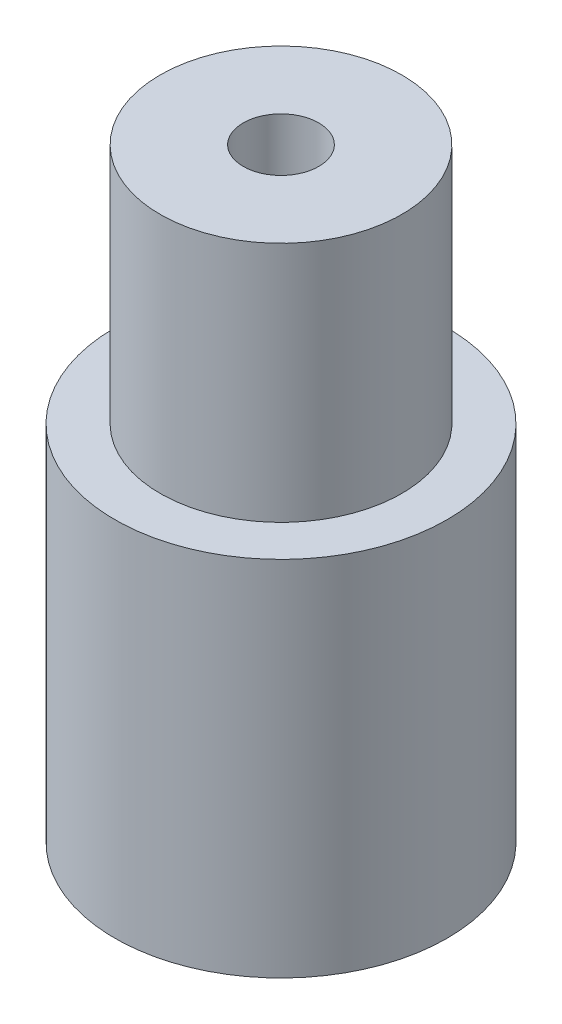
ISO-10303-21;
HEADER;
FILE_DESCRIPTION(('STEP AP214'),'2;1');
FILE_NAME('part.step','',(''),(''),'','','');
FILE_SCHEMA(('AUTOMOTIVE_DESIGN { 1 0 10303 214 1 1 1 1 }'));
ENDSEC;
DATA;
#1=APPLICATION_CONTEXT('core data for automotive mechanical design processes');
#2=APPLICATION_PROTOCOL_DEFINITION('international standard','automotive_design',2000,#1);
#3=PRODUCT_CONTEXT('',#1,'mechanical');
#4=PRODUCT('Part','Part','',(#3));
#5=PRODUCT_RELATED_PRODUCT_CATEGORY('part','',(#4));
#6=PRODUCT_DEFINITION_FORMATION('','',#4);
#7=PRODUCT_DEFINITION_CONTEXT('part definition',#1,'design');
#8=PRODUCT_DEFINITION('design','',#6,#7);
#9=PRODUCT_DEFINITION_SHAPE('','',#8);
#10=(LENGTH_UNIT() NAMED_UNIT(*) SI_UNIT(.MILLI.,.METRE.));
#11=(NAMED_UNIT(*) PLANE_ANGLE_UNIT() SI_UNIT($,.RADIAN.));
#12=(NAMED_UNIT(*) SI_UNIT($,.STERADIAN.) SOLID_ANGLE_UNIT());
#13=UNCERTAINTY_MEASURE_WITH_UNIT(LENGTH_MEASURE(1.E-05),#10,'distance_accuracy_value','');
#14=(GEOMETRIC_REPRESENTATION_CONTEXT(3) GLOBAL_UNCERTAINTY_ASSIGNED_CONTEXT((#13)) GLOBAL_UNIT_ASSIGNED_CONTEXT((#10,
#11,#12)) REPRESENTATION_CONTEXT('',''));
#15=CARTESIAN_POINT('',(0.,0.,0.));
#16=DIRECTION('',(0.,0.,1.));
#17=DIRECTION('',(1.,0.,0.));
#18=AXIS2_PLACEMENT_3D('',#15,#16,#17);
#19=CARTESIAN_POINT('',(0.,0.,0.));
#20=DIRECTION('',(0.,-1.,0.));
#21=DIRECTION('',(1.,0.,0.));
#22=AXIS2_PLACEMENT_3D('',#19,#20,#21);
#23=PLANE('',#22);
#24=CARTESIAN_POINT('',(0.,0.,0.));
#25=DIRECTION('',(0.,1.,0.));
#26=DIRECTION('',(0.,0.,1.));
#27=AXIS2_PLACEMENT_3D('',#24,#25,#26);
#28=CIRCLE('',#27,1.24999999999999);
#29=CARTESIAN_POINT('',(0.,0.,1.24999999999999));
#30=VERTEX_POINT('',#29);
#31=EDGE_CURVE('E135',#30,#30,#28,.T.);
#32=ORIENTED_EDGE('',*,*,#31,.F.);
#33=EDGE_LOOP('',(#32));
#34=FACE_BOUND('',#33,.T.);
#35=CARTESIAN_POINT('',(0.,0.,0.));
#36=DIRECTION('',(0.,1.,0.));
#37=DIRECTION('',(-1.,0.,0.));
#38=AXIS2_PLACEMENT_3D('',#35,#36,#37);
#39=CIRCLE('',#38,4.);
#40=CARTESIAN_POINT('',(-4.,0.,0.));
#41=VERTEX_POINT('',#40);
#42=EDGE_CURVE('E162',#41,#41,#39,.T.);
#43=ORIENTED_EDGE('',*,*,#42,.T.);
#44=EDGE_LOOP('',(#43));
#45=FACE_BOUND('',#44,.T.);
#46=ADVANCED_FACE('F45',(#34,#45),#23,.F.);
#47=CARTESIAN_POINT('',(0.,0.,0.));
#48=DIRECTION('',(0.,1.,0.));
#49=DIRECTION('',(-1.,0.,0.));
#50=AXIS2_PLACEMENT_3D('',#47,#48,#49);
#51=CYLINDRICAL_SURFACE('',#50,4.);
#52=ORIENTED_EDGE('',*,*,#42,.F.);
#53=EDGE_LOOP('',(#52));
#54=FACE_BOUND('',#53,.T.);
#55=CARTESIAN_POINT('',(0.,-8.,0.));
#56=DIRECTION('',(0.,1.,0.));
#57=DIRECTION('',(-1.,0.,0.));
#58=AXIS2_PLACEMENT_3D('',#55,#56,#57);
#59=CIRCLE('',#58,4.);
#60=CARTESIAN_POINT('',(-4.,-8.,0.));
#61=VERTEX_POINT('',#60);
#62=EDGE_CURVE('E166',#61,#61,#59,.T.);
#63=ORIENTED_EDGE('',*,*,#62,.T.);
#64=EDGE_LOOP('',(#63));
#65=FACE_BOUND('',#64,.T.);
#66=ADVANCED_FACE('F189',(#54,#65),#51,.T.);
#67=CARTESIAN_POINT('',(4.,-8.,0.));
#68=DIRECTION('',(0.,-1.,0.));
#69=DIRECTION('',(1.,0.,0.));
#70=AXIS2_PLACEMENT_3D('',#67,#68,#69);
#71=PLANE('',#70);
#72=ORIENTED_EDGE('',*,*,#62,.F.);
#73=EDGE_LOOP('',(#72));
#74=FACE_BOUND('',#73,.T.);
#75=CARTESIAN_POINT('',(0.,-8.,0.));
#76=DIRECTION('',(0.,1.,0.));
#77=DIRECTION('',(-1.,0.,0.));
#78=AXIS2_PLACEMENT_3D('',#75,#76,#77);
#79=CIRCLE('',#78,5.5);
#80=CARTESIAN_POINT('',(-5.5,-8.,0.));
#81=VERTEX_POINT('',#80);
#82=EDGE_CURVE('E170',#81,#81,#79,.T.);
#83=ORIENTED_EDGE('',*,*,#82,.T.);
#84=EDGE_LOOP('',(#83));
#85=FACE_BOUND('',#84,.T.);
#86=ADVANCED_FACE('F194',(#74,#85),#71,.F.);
#87=CARTESIAN_POINT('',(0.,0.,0.));
#88=DIRECTION('',(0.,1.,0.));
#89=DIRECTION('',(-1.,0.,0.));
#90=AXIS2_PLACEMENT_3D('',#87,#88,#89);
#91=CYLINDRICAL_SURFACE('',#90,5.5);
#92=CARTESIAN_POINT('',(-5.5,-17.25,0.));
#93=CARTESIAN_POINT('',(-5.49999873675926,-17.2499977340868,-0.069259139298452));
#94=CARTESIAN_POINT('',(-5.49867854673065,-17.2442243862115,-0.138545086129004));
#95=CARTESIAN_POINT('',(-5.493539660153,-17.2213102619692,-0.275144297299661));
#96=CARTESIAN_POINT('',(-5.48971927481324,-17.2041618020224,-0.342456196110365));
#97=CARTESIAN_POINT('',(-5.48000476561469,-17.1590659756841,-0.473113835992458));
#98=CARTESIAN_POINT('',(-5.4741128942837,-17.1311303360096,-0.536463797478236));
#99=CARTESIAN_POINT('',(-5.46088910081351,-17.0652914433096,-0.657576137912829));
#100=CARTESIAN_POINT('',(-5.45355719301993,-17.0273882895788,-0.71533857251591));
#101=CARTESIAN_POINT('',(-5.4381132908407,-16.9419989776967,-0.824633802223189));
#102=CARTESIAN_POINT('',(-5.42999098791629,-16.8943737132625,-0.876056469460245));
#103=CARTESIAN_POINT('',(-5.41395325591652,-16.7911905129314,-0.970256949083051));
#104=CARTESIAN_POINT('',(-5.40603784654665,-16.7356318246528,-1.01303394060892));
#105=CARTESIAN_POINT('',(-5.39120791846105,-16.6173339723582,-1.08922299700893));
#106=CARTESIAN_POINT('',(-5.38430657902887,-16.5545165018471,-1.12251627178287));
#107=CARTESIAN_POINT('',(-5.37243480737543,-16.4239952497092,-1.17803034858935));
#108=CARTESIAN_POINT('',(-5.36746412440839,-16.3562921039692,-1.20025258858874));
#109=CARTESIAN_POINT('',(-5.36012172349153,-16.2191204064417,-1.23262674706359));
#110=CARTESIAN_POINT('',(-5.3577078986695,-16.1497003684387,-1.24297446340377));
#111=CARTESIAN_POINT('',(-5.35562617033839,-16.0100708863934,-1.25191494225743));
#112=CARTESIAN_POINT('',(-5.35595790132902,-15.9398615486689,-1.25050926943276));
#113=CARTESIAN_POINT('',(-5.35929175179597,-15.8021135583256,-1.23614008479381));
#114=CARTESIAN_POINT('',(-5.36224097064878,-15.7345495469025,-1.22340552299718));
#115=CARTESIAN_POINT('',(-5.37039368363716,-15.6025427569226,-1.18710342460251));
#116=CARTESIAN_POINT('',(-5.3755973132372,-15.5381001661864,-1.16353523702144));
#117=CARTESIAN_POINT('',(-5.38772371922684,-15.4135296640947,-1.10602867201272));
#118=CARTESIAN_POINT('',(-5.39466077989125,-15.3534432411182,-1.07200356043004));
#119=CARTESIAN_POINT('',(-5.40946384216207,-15.2397487234445,-0.994609889602035));
#120=CARTESIAN_POINT('',(-5.41732997981731,-15.186141579868,-0.951239961185667));
#121=CARTESIAN_POINT('',(-5.43333076436253,-15.0856107190895,-0.855182590017578));
#122=CARTESIAN_POINT('',(-5.44146738675749,-15.0388727867418,-0.802300833714133));
#123=CARTESIAN_POINT('',(-5.45692512985791,-14.9548970556464,-0.689356149204857));
#124=CARTESIAN_POINT('',(-5.46424623341467,-14.9176594566503,-0.629293070045396));
#125=CARTESIAN_POINT('',(-5.47727487123187,-14.8536898060142,-0.503453995899573));
#126=CARTESIAN_POINT('',(-5.48297842424367,-14.8269836131888,-0.437664417174074));
#127=CARTESIAN_POINT('',(-5.49209994783491,-14.785057997066,-0.302372561245844));
#128=CARTESIAN_POINT('',(-5.4955182778892,-14.7698367670889,-0.232870869831856));
#129=CARTESIAN_POINT('',(-5.4996325035878,-14.7515868812637,-0.0937199200963626));
#130=CARTESIAN_POINT('',(-5.50038500920564,-14.7483046543416,-0.0241055461685155));
#131=CARTESIAN_POINT('',(-5.49924211275316,-14.7533365199265,0.114676943340055));
#132=CARTESIAN_POINT('',(-5.49734690539558,-14.761649759703,0.183845091360433));
#133=CARTESIAN_POINT('',(-5.49115740518708,-14.7894265834527,0.318920838609233));
#134=CARTESIAN_POINT('',(-5.4868920435275,-14.8087557732219,0.384857518407217));
#135=CARTESIAN_POINT('',(-5.47644030661836,-14.8578655137285,0.512551965438806));
#136=CARTESIAN_POINT('',(-5.47025375902772,-14.8876470021266,0.574309357161447));
#137=CARTESIAN_POINT('',(-5.45650716375474,-14.9573345717777,0.692930426280283));
#138=CARTESIAN_POINT('',(-5.4489276492766,-14.9973878133866,0.7497053426136));
#139=CARTESIAN_POINT('',(-5.43327304782299,-15.0862896642201,0.855818867895264));
#140=CARTESIAN_POINT('',(-5.42519789109562,-15.1351395132734,0.905156426789851));
#141=CARTESIAN_POINT('',(-5.40926438572433,-15.2414154825667,0.996008531090481));
#142=CARTESIAN_POINT('',(-5.40141360596267,-15.2989936208934,1.03734683297031));
#143=CARTESIAN_POINT('',(-5.3870011660802,-15.4204231953351,1.10976907203276));
#144=CARTESIAN_POINT('',(-5.38043944897962,-15.4842743539798,1.14085346250509));
#145=CARTESIAN_POINT('',(-5.36941374353368,-15.6160902347845,1.19166798620964));
#146=CARTESIAN_POINT('',(-5.3649376890851,-15.6840286618717,1.21146358110852));
#147=CARTESIAN_POINT('',(-5.35857055292907,-15.8223834533496,1.23932629170182));
#148=CARTESIAN_POINT('',(-5.35667901955397,-15.8927993825682,1.24739545670807));
#149=CARTESIAN_POINT('',(-5.35572514716112,-16.0323293096554,1.25148369607082));
#150=CARTESIAN_POINT('',(-5.35659707290885,-16.1014347996668,1.24778274250535));
#151=CARTESIAN_POINT('',(-5.3609223423457,-16.2380094550941,1.22906557701641));
#152=CARTESIAN_POINT('',(-5.36437565044739,-16.3054786430552,1.21404952108504));
#153=CARTESIAN_POINT('',(-5.37344130135242,-16.4366216986831,1.17326846180304));
#154=CARTESIAN_POINT('',(-5.37904483343351,-16.5003098455708,1.14754728763997));
#155=CARTESIAN_POINT('',(-5.39178236164053,-16.6225073534503,1.0861226830344));
#156=CARTESIAN_POINT('',(-5.39891653159829,-16.6810161251628,1.05041811865611));
#157=CARTESIAN_POINT('',(-5.41410553631702,-16.7925672138276,0.969124984455245));
#158=CARTESIAN_POINT('',(-5.42217702793932,-16.8454628611037,0.923338228214169));
#159=CARTESIAN_POINT('',(-5.43822274296525,-16.942911592541,0.823578144662086));
#160=CARTESIAN_POINT('',(-5.44619694333323,-16.987462735483,0.769602917703378));
#161=CARTESIAN_POINT('',(-5.46128466945207,-17.0675690301169,0.654070302575283));
#162=CARTESIAN_POINT('',(-5.46838430808557,-17.1029869116666,0.592415810938099));
#163=CARTESIAN_POINT('',(-5.48078202756997,-17.1628999853315,0.463877983855843));
#164=CARTESIAN_POINT('',(-5.48608156233362,-17.1874039973933,0.396998922168846));
#165=CARTESIAN_POINT('',(-5.49337797563919,-17.2206139530881,0.275081535769809));
#166=CARTESIAN_POINT('',(-5.49584542792493,-17.2316119938446,0.220684055569243));
#167=CARTESIAN_POINT('',(-5.49915690403688,-17.2463057367897,0.110863407465458));
#168=CARTESIAN_POINT('',(-5.50000101119415,-17.2500018138096,0.0554402923585501));
#169=CARTESIAN_POINT('',(-5.5,-17.25,0.));
#170=B_SPLINE_CURVE_WITH_KNOTS('',3,(#92,#93,#94,#95,#96,#97,#98,#99,#100,#101,#102,#103,#104,
#105,#106,#107,#108,#109,#110,#111,#112,#113,#114,#115,#116,#117,#118,#119,#120,#121,#122,#123,
#124,#125,#126,#127,#128,#129,#130,#131,#132,#133,#134,#135,#136,#137,#138,#139,#140,#141,#142,
#143,#144,#145,#146,#147,#148,#149,#150,#151,#152,#153,#154,#155,#156,#157,#158,#159,#160,#161,
#162,#163,#164,#165,#166,#167,#168,#169),.UNSPECIFIED.,.T.,.F.,(4,2,2,2,2,2,2,2,2,2,2,2,2,2,2,2,
2,2,2,2,2,2,2,2,2,2,2,2,2,2,2,2,2,2,2,2,2,2,4),(0.,0.207574424816657,0.415289203498465,
0.622778808776592,0.830266347152626,1.04096194698404,1.25167754182901,1.46492681486707,
1.67814838269119,1.88780122449041,2.09742615684379,2.30290857087117,2.50840333376985,
2.71565078719425,2.92292862648989,3.13505765901852,3.34719115134931,3.55984232048323,
3.77246003084947,3.98053470958381,4.18859408731813,4.39416788074517,4.59976012061541,
4.80848064664383,5.01723061362837,5.23015660770197,5.44307318779738,5.65474220954494,
5.86637423554699,6.07301021975726,6.27964335529767,6.48543868288073,6.691257394659,
6.90155512892954,7.11190172510033,7.32524638726732,7.53841832261077,7.70458523862179,
7.87074362457),.UNSPECIFIED.);
#171=CARTESIAN_POINT('',(-5.5,-17.25,0.));
#172=VERTEX_POINT('',#171);
#173=EDGE_CURVE('E126',#172,#172,#170,.T.);
#174=ORIENTED_EDGE('',*,*,#173,.T.);
#175=EDGE_LOOP('',(#174));
#176=FACE_BOUND('',#175,.T.);
#177=ORIENTED_EDGE('',*,*,#82,.F.);
#178=EDGE_LOOP('',(#177));
#179=FACE_BOUND('',#178,.T.);
#180=CARTESIAN_POINT('',(0.,-20.,0.));
#181=DIRECTION('',(0.,1.,0.));
#182=DIRECTION('',(-1.,0.,0.));
#183=AXIS2_PLACEMENT_3D('',#180,#181,#182);
#184=CIRCLE('',#183,5.5);
#185=CARTESIAN_POINT('',(-5.5,-20.,0.));
#186=VERTEX_POINT('',#185);
#187=EDGE_CURVE('E174',#186,#186,#184,.T.);
#188=ORIENTED_EDGE('',*,*,#187,.T.);
#189=EDGE_LOOP('',(#188));
#190=FACE_BOUND('',#189,.T.);
#191=ADVANCED_FACE('F137',(#176,#179,#190),#91,.T.);
#192=CARTESIAN_POINT('',(5.5,-20.,0.));
#193=DIRECTION('',(0.,1.,0.));
#194=DIRECTION('',(-1.,0.,0.));
#195=AXIS2_PLACEMENT_3D('',#192,#193,#194);
#196=PLANE('',#195);
#197=DIRECTION('',(0.,0.,-1.));
#198=VECTOR('',#197,1.);
#199=CARTESIAN_POINT('',(-0.999999999999999,-20.,1.1180339887499));
#200=LINE('',#199,#198);
#201=CARTESIAN_POINT('',(-1.,-20.,1.1180339887499));
#202=VERTEX_POINT('',#201);
#203=CARTESIAN_POINT('',(-0.999999999999999,-20.,-1.1180339887499));
#204=VERTEX_POINT('',#203);
#205=EDGE_CURVE('E113',#202,#204,#200,.T.);
#206=ORIENTED_EDGE('',*,*,#205,.F.);
#207=CARTESIAN_POINT('',(0.,-20.,0.));
#208=DIRECTION('',(0.,-1.,0.));
#209=DIRECTION('',(1.,0.,0.));
#210=AXIS2_PLACEMENT_3D('',#207,#208,#209);
#211=CIRCLE('',#210,1.5);
#212=EDGE_CURVE('E68',#204,#202,#211,.T.);
#213=ORIENTED_EDGE('',*,*,#212,.F.);
#214=EDGE_LOOP('',(#206,#213));
#215=FACE_BOUND('',#214,.T.);
#216=ORIENTED_EDGE('',*,*,#187,.F.);
#217=EDGE_LOOP('',(#216));
#218=FACE_BOUND('',#217,.T.);
#219=ADVANCED_FACE('F203',(#215,#218),#196,.F.);
#220=CARTESIAN_POINT('',(0.,-7.24892422621555,0.));
#221=DIRECTION('',(0.,1.,0.));
#222=DIRECTION('',(0.,0.,1.));
#223=AXIS2_PLACEMENT_3D('',#220,#221,#222);
#224=CONICAL_SURFACE('',#223,1.25,1.02974425867665);
#225=CARTESIAN_POINT('',(0.,-8.,0.));
#226=VERTEX_POINT('',#225);
#227=VERTEX_LOOP('',#226);
#228=FACE_BOUND('',#227,.T.);
#229=CARTESIAN_POINT('',(0.,-7.24892422621555,0.));
#230=DIRECTION('',(0.,1.,0.));
#231=DIRECTION('',(0.,0.,1.));
#232=AXIS2_PLACEMENT_3D('',#229,#230,#231);
#233=CIRCLE('',#232,1.25);
#234=CARTESIAN_POINT('',(0.,-7.24892422621555,1.25));
#235=VERTEX_POINT('',#234);
#236=EDGE_CURVE('E177',#235,#235,#233,.T.);
#237=ORIENTED_EDGE('',*,*,#236,.T.);
#238=EDGE_LOOP('',(#237));
#239=FACE_BOUND('',#238,.T.);
#240=ADVANCED_FACE('F208',(#228,#239),#224,.F.);
#241=CARTESIAN_POINT('',(0.,0.,0.));
#242=DIRECTION('',(0.,1.,0.));
#243=DIRECTION('',(0.,0.,1.));
#244=AXIS2_PLACEMENT_3D('',#241,#242,#243);
#245=CYLINDRICAL_SURFACE('',#244,1.24999999999999);
#246=ORIENTED_EDGE('',*,*,#236,.F.);
#247=EDGE_LOOP('',(#246));
#248=FACE_BOUND('',#247,.T.);
#249=ORIENTED_EDGE('',*,*,#31,.T.);
#250=EDGE_LOOP('',(#249));
#251=FACE_BOUND('',#250,.T.);
#252=ADVANCED_FACE('F145',(#248,#251),#245,.F.);
#253=CARTESIAN_POINT('',(-5.5,-16.,0.));
#254=DIRECTION('',(-1.,0.,0.));
#255=DIRECTION('',(0.,0.,1.));
#256=AXIS2_PLACEMENT_3D('',#253,#254,#255);
#257=CYLINDRICAL_SURFACE('',#256,1.25);
#258=CARTESIAN_POINT('',(-1.,-16.5590169943749,-1.11803398874989));
#259=CARTESIAN_POINT('',(-0.977096254349307,-16.5178686396737,-1.13857860863783));
#260=CARTESIAN_POINT('',(-0.954834888962879,-16.4750896012,-1.15715463647348));
#261=CARTESIAN_POINT('',(-0.9135267099509,-16.3855944312938,-1.19001901787295));
#262=CARTESIAN_POINT('',(-0.894534352945983,-16.3388280341241,-1.20423734325992));
#263=CARTESIAN_POINT('',(-0.865332804069959,-16.2504121686192,-1.22534612886523));
#264=CARTESIAN_POINT('',(-0.854168540208176,-16.2092976661763,-1.23308315404764));
#265=CARTESIAN_POINT('',(-0.837619666879021,-16.1255866485009,-1.2443858418742));
#266=CARTESIAN_POINT('',(-0.832197437558489,-16.083001691285,-1.24797866991172));
#267=CARTESIAN_POINT('',(-0.828045572211516,-15.9970411102682,-1.25073963920085));
#268=CARTESIAN_POINT('',(-0.829362779882017,-15.9536620462942,-1.24987681020257));
#269=CARTESIAN_POINT('',(-0.838530186730642,-15.8678245427866,-1.24374164960621));
#270=CARTESIAN_POINT('',(-0.846402309049567,-15.8253696838979,-1.23845452048717));
#271=CARTESIAN_POINT('',(-0.870453905312293,-15.7299412468444,-1.22171149986377));
#272=CARTESIAN_POINT('',(-0.888428976076248,-15.6776834079658,-1.20887087254081));
#273=CARTESIAN_POINT('',(-0.929594124098171,-15.5771937709929,-1.1775054597912));
#274=CARTESIAN_POINT('',(-0.952787865985178,-15.5289648348479,-1.15897667670856));
#275=CARTESIAN_POINT('',(-0.984767315180273,-15.4685857953032,-1.13151840198589));
#276=CARTESIAN_POINT('',(-0.992339779812187,-15.4546977950337,-1.12488870925709));
#277=CARTESIAN_POINT('',(-1.,-15.4409830056251,-1.1180339887499));
#278=B_SPLINE_CURVE_WITH_KNOTS('',3,(#258,#259,#260,#261,#262,#263,#264,#265,#266,#267,#268,
#269,#270,#271,#272,#273,#274,#275,#276,#277),.UNSPECIFIED.,.F.,.F.,(4,2,2,2,2,2,2,2,2,4),(0.,
0.154446218203405,0.311257953630678,0.440652634002262,0.56919421809386,0.698630462743127,
0.828501358435829,0.997767267295414,1.1671524102355,1.2185904209328),.UNSPECIFIED.);
#279=CARTESIAN_POINT('',(-0.999999999999999,-16.5590169943749,-1.1180339887499));
#280=VERTEX_POINT('',#279);
#281=CARTESIAN_POINT('',(-0.999999999999999,-15.4409830056251,-1.1180339887499));
#282=VERTEX_POINT('',#281);
#283=EDGE_CURVE('E152',#280,#282,#278,.T.);
#284=ORIENTED_EDGE('',*,*,#283,.T.);
#285=CARTESIAN_POINT('',(-0.999999999999999,-16.,0.));
#286=DIRECTION('',(-1.,0.,0.));
#287=DIRECTION('',(0.,-1.,0.));
#288=AXIS2_PLACEMENT_3D('',#285,#286,#287);
#289=CIRCLE('',#288,1.25);
#290=CARTESIAN_POINT('',(-0.999999999999999,-15.4409830056251,1.1180339887499));
#291=VERTEX_POINT('',#290);
#292=EDGE_CURVE('E11',#282,#291,#289,.F.);
#293=ORIENTED_EDGE('',*,*,#292,.T.);
#294=CARTESIAN_POINT('',(-1.,-15.4409830056251,1.11803398874989));
#295=CARTESIAN_POINT('',(-0.977096254349306,-15.4821313603263,1.13857860863783));
#296=CARTESIAN_POINT('',(-0.954834888962878,-15.5249103988,1.15715463647348));
#297=CARTESIAN_POINT('',(-0.913526709950898,-15.6144055687062,1.19001901787295));
#298=CARTESIAN_POINT('',(-0.89453435294598,-15.6611719658759,1.20423734325992));
#299=CARTESIAN_POINT('',(-0.865332804069957,-15.7495878313808,1.22534612886524));
#300=CARTESIAN_POINT('',(-0.854168540208174,-15.7907023338237,1.23308315404764));
#301=CARTESIAN_POINT('',(-0.837619666879019,-15.8744133514991,1.24438584187421));
#302=CARTESIAN_POINT('',(-0.832197437558485,-15.916998308715,1.24797866991172));
#303=CARTESIAN_POINT('',(-0.82804557221151,-16.0029588897318,1.25073963920086));
#304=CARTESIAN_POINT('',(-0.82936277988201,-16.0463379537058,1.24987681020257));
#305=CARTESIAN_POINT('',(-0.838530186730635,-16.1321754572134,1.24374164960622));
#306=CARTESIAN_POINT('',(-0.846402309049558,-16.174630316102,1.23845452048717));
#307=CARTESIAN_POINT('',(-0.870453905312282,-16.2700587531556,1.22171149986377));
#308=CARTESIAN_POINT('',(-0.888428976076237,-16.3223165920342,1.20887087254082));
#309=CARTESIAN_POINT('',(-0.929594124098157,-16.422806229007,1.17750545979121));
#310=CARTESIAN_POINT('',(-0.952787865985161,-16.4710351651521,1.15897667670858));
#311=CARTESIAN_POINT('',(-0.984767315180261,-16.5314142046968,1.1315184019859));
#312=CARTESIAN_POINT('',(-0.992339779812181,-16.5453022049663,1.1248887092571));
#313=CARTESIAN_POINT('',(-1.,-16.559016994375,1.1180339887499));
#314=B_SPLINE_CURVE_WITH_KNOTS('',3,(#294,#295,#296,#297,#298,#299,#300,#301,#302,#303,#304,
#305,#306,#307,#308,#309,#310,#311,#312,#313),.UNSPECIFIED.,.F.,.F.,(4,2,2,2,2,2,2,2,2,4),(0.,
0.154446218203408,0.31125795363068,0.440652634002256,0.569194218093856,0.698630462743122,
0.82850135843582,0.997767267295397,1.16715241023548,1.21859042093282),.UNSPECIFIED.);
#315=CARTESIAN_POINT('',(-0.999999999999999,-16.559016994375,1.1180339887499));
#316=VERTEX_POINT('',#315);
#317=EDGE_CURVE('E48',#291,#316,#314,.T.);
#318=ORIENTED_EDGE('',*,*,#317,.T.);
#319=EDGE_CURVE('E61',#316,#280,#289,.F.);
#320=ORIENTED_EDGE('',*,*,#319,.T.);
#321=EDGE_LOOP('',(#284,#293,#318,#320));
#322=FACE_BOUND('',#321,.T.);
#323=ORIENTED_EDGE('',*,*,#173,.F.);
#324=EDGE_LOOP('',(#323));
#325=FACE_BOUND('',#324,.T.);
#326=ADVANCED_FACE('F141',(#322,#325),#257,.F.);
#327=CARTESIAN_POINT('',(0.,-10.,0.));
#328=DIRECTION('',(0.,-1.,0.));
#329=DIRECTION('',(1.,0.,0.));
#330=AXIS2_PLACEMENT_3D('',#327,#328,#329);
#331=CYLINDRICAL_SURFACE('',#330,1.5);
#332=DIRECTION('',(0.,-1.,0.));
#333=VECTOR('',#332,1.);
#334=CARTESIAN_POINT('',(-1.,-10.,1.1180339887499));
#335=LINE('',#334,#333);
#336=CARTESIAN_POINT('',(-1.,-10.,1.1180339887499));
#337=VERTEX_POINT('',#336);
#338=EDGE_CURVE('E97',#337,#291,#335,.T.);
#339=ORIENTED_EDGE('',*,*,#338,.F.);
#340=CARTESIAN_POINT('',(0.,-10.,0.));
#341=DIRECTION('',(0.,-1.,0.));
#342=DIRECTION('',(1.,0.,0.));
#343=AXIS2_PLACEMENT_3D('',#340,#341,#342);
#344=CIRCLE('',#343,1.5);
#345=CARTESIAN_POINT('',(-1.,-10.,-1.1180339887499));
#346=VERTEX_POINT('',#345);
#347=EDGE_CURVE('E101',#346,#337,#344,.T.);
#348=ORIENTED_EDGE('',*,*,#347,.F.);
#349=DIRECTION('',(0.,-1.,0.));
#350=VECTOR('',#349,1.);
#351=CARTESIAN_POINT('',(-1.,-10.,-1.1180339887499));
#352=LINE('',#351,#350);
#353=EDGE_CURVE('E116',#346,#282,#352,.T.);
#354=ORIENTED_EDGE('',*,*,#353,.T.);
#355=ORIENTED_EDGE('',*,*,#283,.F.);
#356=EDGE_CURVE('E75',#280,#204,#352,.T.);
#357=ORIENTED_EDGE('',*,*,#356,.T.);
#358=ORIENTED_EDGE('',*,*,#212,.T.);
#359=EDGE_CURVE('E107',#316,#202,#335,.T.);
#360=ORIENTED_EDGE('',*,*,#359,.F.);
#361=ORIENTED_EDGE('',*,*,#317,.F.);
#362=EDGE_LOOP('',(#339,#348,#354,#355,#357,#358,#360,#361));
#363=FACE_BOUND('',#362,.T.);
#364=ADVANCED_FACE('F99',(#363),#331,.F.);
#365=CARTESIAN_POINT('',(-1.,-10.,1.1180339887499));
#366=DIRECTION('',(-1.,0.,0.));
#367=DIRECTION('',(0.,-1.,0.));
#368=AXIS2_PLACEMENT_3D('',#365,#366,#367);
#369=PLANE('',#368);
#370=ORIENTED_EDGE('',*,*,#353,.F.);
#371=DIRECTION('',(0.,0.,-1.));
#372=VECTOR('',#371,1.);
#373=CARTESIAN_POINT('',(-1.,-10.,1.1180339887499));
#374=LINE('',#373,#372);
#375=EDGE_CURVE('E111',#337,#346,#374,.T.);
#376=ORIENTED_EDGE('',*,*,#375,.F.);
#377=ORIENTED_EDGE('',*,*,#338,.T.);
#378=ORIENTED_EDGE('',*,*,#292,.F.);
#379=EDGE_LOOP('',(#370,#376,#377,#378));
#380=FACE_BOUND('',#379,.T.);
#381=ADVANCED_FACE('F115',(#380),#369,.F.);
#382=ORIENTED_EDGE('',*,*,#359,.T.);
#383=ORIENTED_EDGE('',*,*,#205,.T.);
#384=ORIENTED_EDGE('',*,*,#356,.F.);
#385=ORIENTED_EDGE('',*,*,#319,.F.);
#386=EDGE_LOOP('',(#382,#383,#384,#385));
#387=FACE_BOUND('',#386,.T.);
#388=ADVANCED_FACE('F217',(#387),#369,.F.);
#389=CARTESIAN_POINT('',(0.500000000000002,-10.,0.));
#390=DIRECTION('',(0.,1.,0.));
#391=DIRECTION('',(-1.,0.,0.));
#392=AXIS2_PLACEMENT_3D('',#389,#390,#391);
#393=PLANE('',#392);
#394=ORIENTED_EDGE('',*,*,#347,.T.);
#395=ORIENTED_EDGE('',*,*,#375,.T.);
#396=EDGE_LOOP('',(#394,#395));
#397=FACE_BOUND('',#396,.T.);
#398=ADVANCED_FACE('F110',(#397),#393,.F.);
#399=CLOSED_SHELL('',(#46,#66,#86,#191,#219,#240,#252,#326,#364,#381,#388,#398));
#400=MANIFOLD_SOLID_BREP('B2',#399);
#401=ADVANCED_BREP_SHAPE_REPRESENTATION('',(#18,#400),#14);
#402=SHAPE_DEFINITION_REPRESENTATION(#9,#401);
ENDSEC;
END-ISO-10303-21;
